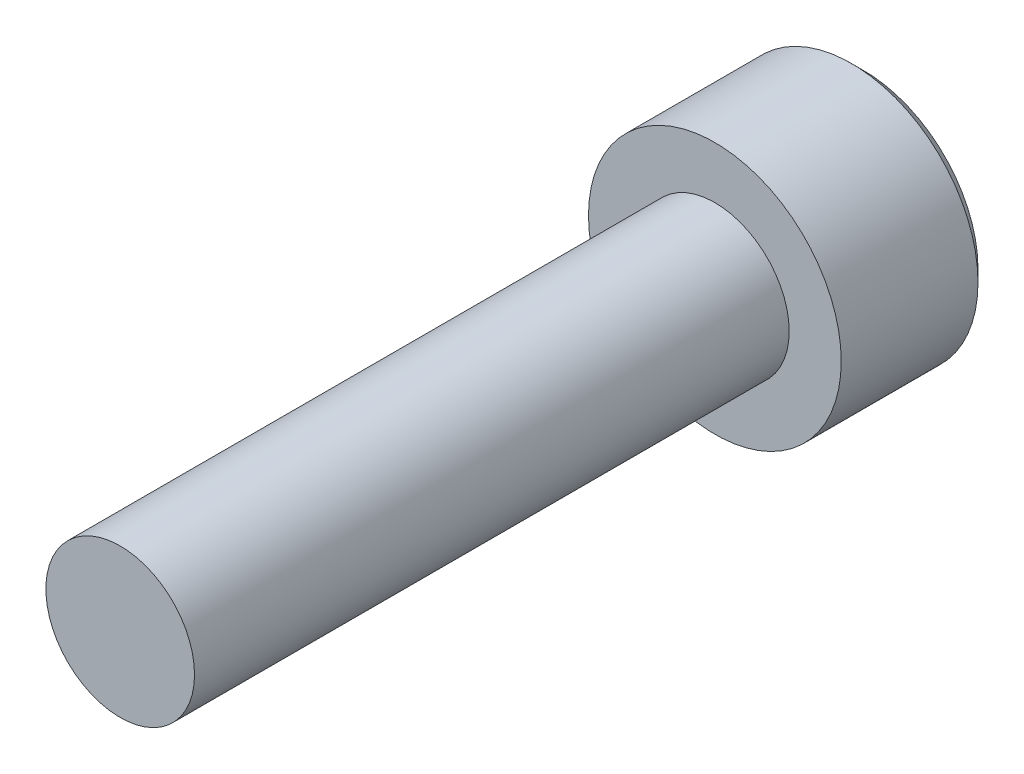
ISO-10303-21;
HEADER;
FILE_DESCRIPTION(('STEP AP214'),'2;1');
FILE_NAME('part.step','',(''),(''),'','','');
FILE_SCHEMA(('AUTOMOTIVE_DESIGN { 1 0 10303 214 1 1 1 1 }'));
ENDSEC;
DATA;
#1=APPLICATION_CONTEXT('core data for automotive mechanical design processes');
#2=APPLICATION_PROTOCOL_DEFINITION('international standard','automotive_design',2000,#1);
#3=PRODUCT_CONTEXT('',#1,'mechanical');
#4=PRODUCT('Part','Part','',(#3));
#5=PRODUCT_RELATED_PRODUCT_CATEGORY('part','',(#4));
#6=PRODUCT_DEFINITION_FORMATION('','',#4);
#7=PRODUCT_DEFINITION_CONTEXT('part definition',#1,'design');
#8=PRODUCT_DEFINITION('design','',#6,#7);
#9=PRODUCT_DEFINITION_SHAPE('','',#8);
#10=(LENGTH_UNIT() NAMED_UNIT(*) SI_UNIT(.MILLI.,.METRE.));
#11=(NAMED_UNIT(*) PLANE_ANGLE_UNIT() SI_UNIT($,.RADIAN.));
#12=(NAMED_UNIT(*) SI_UNIT($,.STERADIAN.) SOLID_ANGLE_UNIT());
#13=UNCERTAINTY_MEASURE_WITH_UNIT(LENGTH_MEASURE(1.E-05),#10,'distance_accuracy_value','');
#14=(GEOMETRIC_REPRESENTATION_CONTEXT(3) GLOBAL_UNCERTAINTY_ASSIGNED_CONTEXT((#13)) GLOBAL_UNIT_ASSIGNED_CONTEXT((#10,
#11,#12)) REPRESENTATION_CONTEXT('',''));
#15=CARTESIAN_POINT('',(0.,0.,0.));
#16=DIRECTION('',(0.,0.,1.));
#17=DIRECTION('',(1.,0.,0.));
#18=AXIS2_PLACEMENT_3D('',#15,#16,#17);
#19=CARTESIAN_POINT('',(0.,0.,0.));
#20=DIRECTION('',(0.,0.,1.));
#21=DIRECTION('',(1.,0.,0.));
#22=AXIS2_PLACEMENT_3D('',#19,#20,#21);
#23=PLANE('',#22);
#24=DIRECTION('',(0.5,-0.866025403784439,0.));
#25=VECTOR('',#24,1.);
#26=CARTESIAN_POINT('',(-1.50111069989302,-2.2,0.));
#27=LINE('',#26,#25);
#28=CARTESIAN_POINT('',(-2.7712812921102,0.,0.));
#29=VERTEX_POINT('',#28);
#30=CARTESIAN_POINT('',(-1.3856406460551,-2.4,0.));
#31=VERTEX_POINT('',#30);
#32=EDGE_CURVE('E163',#29,#31,#27,.T.);
#33=ORIENTED_EDGE('',*,*,#32,.T.);
#34=DIRECTION('',(1.,0.,0.));
#35=VECTOR('',#34,1.);
#36=CARTESIAN_POINT('',(1.15470053837925,-2.4,0.));
#37=LINE('',#36,#35);
#38=CARTESIAN_POINT('',(1.3856406460551,-2.4,0.));
#39=VERTEX_POINT('',#38);
#40=EDGE_CURVE('E165',#31,#39,#37,.T.);
#41=ORIENTED_EDGE('',*,*,#40,.T.);
#42=DIRECTION('',(0.5,0.866025403784439,0.));
#43=VECTOR('',#42,1.);
#44=CARTESIAN_POINT('',(2.65581123827227,-0.199999999999998,0.));
#45=LINE('',#44,#43);
#46=CARTESIAN_POINT('',(2.7712812921102,0.,0.));
#47=VERTEX_POINT('',#46);
#48=EDGE_CURVE('E155',#39,#47,#45,.T.);
#49=ORIENTED_EDGE('',*,*,#48,.T.);
#50=DIRECTION('',(-0.5,0.866025403784439,0.));
#51=VECTOR('',#50,1.);
#52=CARTESIAN_POINT('',(1.50111069989302,2.2,0.));
#53=LINE('',#52,#51);
#54=CARTESIAN_POINT('',(1.3856406460551,2.4,0.));
#55=VERTEX_POINT('',#54);
#56=EDGE_CURVE('E157',#47,#55,#53,.T.);
#57=ORIENTED_EDGE('',*,*,#56,.T.);
#58=DIRECTION('',(-1.,0.,0.));
#59=VECTOR('',#58,1.);
#60=CARTESIAN_POINT('',(-1.15470053837925,2.4,0.));
#61=LINE('',#60,#59);
#62=CARTESIAN_POINT('',(-1.3856406460551,2.4,0.));
#63=VERTEX_POINT('',#62);
#64=EDGE_CURVE('E159',#55,#63,#61,.T.);
#65=ORIENTED_EDGE('',*,*,#64,.T.);
#66=DIRECTION('',(-0.5,-0.866025403784439,0.));
#67=VECTOR('',#66,1.);
#68=CARTESIAN_POINT('',(-2.65581123827227,0.199999999999998,0.));
#69=LINE('',#68,#67);
#70=EDGE_CURVE('E161',#63,#29,#69,.T.);
#71=ORIENTED_EDGE('',*,*,#70,.T.);
#72=EDGE_LOOP('',(#33,#41,#49,#57,#65,#71));
#73=FACE_BOUND('',#72,.T.);
#74=CARTESIAN_POINT('',(0.,0.,0.));
#75=DIRECTION('',(0.,0.,1.));
#76=DIRECTION('',(1.,0.,0.));
#77=AXIS2_PLACEMENT_3D('',#74,#75,#76);
#78=CIRCLE('',#77,3.85);
#79=CARTESIAN_POINT('',(3.85,0.,0.));
#80=VERTEX_POINT('',#79);
#81=EDGE_CURVE('E150',#80,#80,#78,.F.);
#82=ORIENTED_EDGE('',*,*,#81,.T.);
#83=EDGE_LOOP('',(#82));
#84=FACE_BOUND('',#83,.T.);
#85=ADVANCED_FACE('F43',(#73,#84),#23,.F.);
#86=CARTESIAN_POINT('',(0.,0.,25.));
#87=DIRECTION('',(0.,0.,-1.));
#88=DIRECTION('',(-1.,0.,0.));
#89=AXIS2_PLACEMENT_3D('',#86,#87,#88);
#90=CYLINDRICAL_SURFACE('',#89,2.5);
#91=CARTESIAN_POINT('',(0.,0.,5.));
#92=DIRECTION('',(0.,0.,1.));
#93=DIRECTION('',(1.,0.,0.));
#94=AXIS2_PLACEMENT_3D('',#91,#92,#93);
#95=CIRCLE('',#94,2.5);
#96=CARTESIAN_POINT('',(2.5,0.,5.));
#97=VERTEX_POINT('',#96);
#98=EDGE_CURVE('E141',#97,#97,#95,.T.);
#99=ORIENTED_EDGE('',*,*,#98,.T.);
#100=EDGE_LOOP('',(#99));
#101=FACE_BOUND('',#100,.T.);
#102=CARTESIAN_POINT('',(0.,0.,25.));
#103=DIRECTION('',(0.,0.,1.));
#104=DIRECTION('',(1.,0.,0.));
#105=AXIS2_PLACEMENT_3D('',#102,#103,#104);
#106=CIRCLE('',#105,2.5);
#107=CARTESIAN_POINT('',(2.5,0.,25.));
#108=VERTEX_POINT('',#107);
#109=EDGE_CURVE('E147',#108,#108,#106,.T.);
#110=ORIENTED_EDGE('',*,*,#109,.F.);
#111=EDGE_LOOP('',(#110));
#112=FACE_BOUND('',#111,.T.);
#113=ADVANCED_FACE('F251',(#101,#112),#90,.T.);
#114=CARTESIAN_POINT('',(0.,0.,25.));
#115=DIRECTION('',(0.,0.,1.));
#116=DIRECTION('',(1.,0.,0.));
#117=AXIS2_PLACEMENT_3D('',#114,#115,#116);
#118=PLANE('',#117);
#119=ORIENTED_EDGE('',*,*,#109,.T.);
#120=EDGE_LOOP('',(#119));
#121=FACE_BOUND('',#120,.T.);
#122=ADVANCED_FACE('F259',(#121),#118,.T.);
#123=CARTESIAN_POINT('',(0.,0.,5.));
#124=DIRECTION('',(0.,0.,-1.));
#125=DIRECTION('',(-1.,0.,0.));
#126=AXIS2_PLACEMENT_3D('',#123,#124,#125);
#127=CYLINDRICAL_SURFACE('',#126,4.25);
#128=CARTESIAN_POINT('',(0.,0.,0.399999999999996));
#129=DIRECTION('',(0.,0.,1.));
#130=DIRECTION('',(1.,0.,0.));
#131=AXIS2_PLACEMENT_3D('',#128,#129,#130);
#132=CIRCLE('',#131,4.25);
#133=CARTESIAN_POINT('',(4.25,0.,0.399999999999996));
#134=VERTEX_POINT('',#133);
#135=EDGE_CURVE('E11',#134,#134,#132,.T.);
#136=ORIENTED_EDGE('',*,*,#135,.T.);
#137=EDGE_LOOP('',(#136));
#138=FACE_BOUND('',#137,.T.);
#139=CARTESIAN_POINT('',(0.,0.,5.));
#140=DIRECTION('',(0.,0.,1.));
#141=DIRECTION('',(1.,0.,0.));
#142=AXIS2_PLACEMENT_3D('',#139,#140,#141);
#143=CIRCLE('',#142,4.25);
#144=CARTESIAN_POINT('',(4.25,0.,5.));
#145=VERTEX_POINT('',#144);
#146=EDGE_CURVE('E137',#145,#145,#143,.T.);
#147=ORIENTED_EDGE('',*,*,#146,.F.);
#148=EDGE_LOOP('',(#147));
#149=FACE_BOUND('',#148,.T.);
#150=ADVANCED_FACE('F367',(#138,#149),#127,.T.);
#151=CARTESIAN_POINT('',(0.,0.,5.));
#152=DIRECTION('',(0.,0.,1.));
#153=DIRECTION('',(1.,0.,0.));
#154=AXIS2_PLACEMENT_3D('',#151,#152,#153);
#155=PLANE('',#154);
#156=ORIENTED_EDGE('',*,*,#98,.F.);
#157=EDGE_LOOP('',(#156));
#158=FACE_BOUND('',#157,.T.);
#159=ORIENTED_EDGE('',*,*,#146,.T.);
#160=EDGE_LOOP('',(#159));
#161=FACE_BOUND('',#160,.T.);
#162=ADVANCED_FACE('F369',(#158,#161),#155,.T.);
#163=CARTESIAN_POINT('',(1.15470053837925,-2.,3.));
#164=DIRECTION('',(-0.866025403784439,0.5,0.));
#165=DIRECTION('',(-0.5,-0.866025403784439,0.));
#166=AXIS2_PLACEMENT_3D('',#163,#164,#165);
#167=PLANE('',#166);
#168=DIRECTION('',(0.,0.,-1.));
#169=VECTOR('',#168,1.);
#170=CARTESIAN_POINT('',(2.3094010767585,0.,3.));
#171=LINE('',#170,#169);
#172=CARTESIAN_POINT('',(2.3094010767585,0.,3.));
#173=VERTEX_POINT('',#172);
#174=CARTESIAN_POINT('',(2.3094010767585,0.,0.399999999999998));
#175=VERTEX_POINT('',#174);
#176=EDGE_CURVE('E131',#173,#175,#171,.T.);
#177=ORIENTED_EDGE('',*,*,#176,.T.);
#178=DIRECTION('',(-0.5,-0.866025403784439,0.));
#179=VECTOR('',#178,1.);
#180=CARTESIAN_POINT('',(1.15470053837925,-2.,0.399999999999998));
#181=LINE('',#180,#179);
#182=CARTESIAN_POINT('',(1.15470053837925,-2.,0.399999999999998));
#183=VERTEX_POINT('',#182);
#184=EDGE_CURVE('E53',#175,#183,#181,.T.);
#185=ORIENTED_EDGE('',*,*,#184,.T.);
#186=DIRECTION('',(0.,0.,-1.));
#187=VECTOR('',#186,1.);
#188=CARTESIAN_POINT('',(1.15470053837925,-2.,3.));
#189=LINE('',#188,#187);
#190=CARTESIAN_POINT('',(1.15470053837925,-2.,3.));
#191=VERTEX_POINT('',#190);
#192=EDGE_CURVE('E134',#191,#183,#189,.T.);
#193=ORIENTED_EDGE('',*,*,#192,.F.);
#194=DIRECTION('',(0.5,0.866025403784439,0.));
#195=VECTOR('',#194,1.);
#196=CARTESIAN_POINT('',(1.15470053837925,-2.,3.));
#197=LINE('',#196,#195);
#198=EDGE_CURVE('E124',#191,#173,#197,.T.);
#199=ORIENTED_EDGE('',*,*,#198,.T.);
#200=EDGE_LOOP('',(#177,#185,#193,#199));
#201=FACE_BOUND('',#200,.T.);
#202=ADVANCED_FACE('F130',(#201),#167,.T.);
#203=CARTESIAN_POINT('',(2.3094010767585,0.,3.));
#204=DIRECTION('',(-0.866025403784439,-0.5,0.));
#205=DIRECTION('',(0.5,-0.866025403784439,0.));
#206=AXIS2_PLACEMENT_3D('',#203,#204,#205);
#207=PLANE('',#206);
#208=DIRECTION('',(0.,0.,-1.));
#209=VECTOR('',#208,1.);
#210=CARTESIAN_POINT('',(1.15470053837925,2.,3.));
#211=LINE('',#210,#209);
#212=CARTESIAN_POINT('',(1.15470053837925,2.,3.));
#213=VERTEX_POINT('',#212);
#214=CARTESIAN_POINT('',(1.15470053837925,2.,0.399999999999998));
#215=VERTEX_POINT('',#214);
#216=EDGE_CURVE('E138',#213,#215,#211,.T.);
#217=ORIENTED_EDGE('',*,*,#216,.T.);
#218=DIRECTION('',(0.5,-0.866025403784439,0.));
#219=VECTOR('',#218,1.);
#220=CARTESIAN_POINT('',(2.3094010767585,0.,0.399999999999998));
#221=LINE('',#220,#219);
#222=EDGE_CURVE('E61',#215,#175,#221,.T.);
#223=ORIENTED_EDGE('',*,*,#222,.T.);
#224=ORIENTED_EDGE('',*,*,#176,.F.);
#225=DIRECTION('',(-0.5,0.866025403784439,0.));
#226=VECTOR('',#225,1.);
#227=CARTESIAN_POINT('',(2.3094010767585,0.,3.));
#228=LINE('',#227,#226);
#229=EDGE_CURVE('E120',#173,#213,#228,.T.);
#230=ORIENTED_EDGE('',*,*,#229,.T.);
#231=EDGE_LOOP('',(#217,#223,#224,#230));
#232=FACE_BOUND('',#231,.T.);
#233=ADVANCED_FACE('F136',(#232),#207,.T.);
#234=CARTESIAN_POINT('',(1.15470053837925,2.,3.));
#235=DIRECTION('',(0.,-1.,0.));
#236=DIRECTION('',(0.,0.,-1.));
#237=AXIS2_PLACEMENT_3D('',#234,#235,#236);
#238=PLANE('',#237);
#239=DIRECTION('',(0.,0.,-1.));
#240=VECTOR('',#239,1.);
#241=CARTESIAN_POINT('',(-1.15470053837925,2.,3.));
#242=LINE('',#241,#240);
#243=CARTESIAN_POINT('',(-1.15470053837925,2.,3.));
#244=VERTEX_POINT('',#243);
#245=CARTESIAN_POINT('',(-1.15470053837925,2.,0.399999999999998));
#246=VERTEX_POINT('',#245);
#247=EDGE_CURVE('E143',#244,#246,#242,.T.);
#248=ORIENTED_EDGE('',*,*,#247,.T.);
#249=DIRECTION('',(1.,0.,0.));
#250=VECTOR('',#249,1.);
#251=CARTESIAN_POINT('',(1.15470053837925,2.,0.399999999999998));
#252=LINE('',#251,#250);
#253=EDGE_CURVE('E69',#246,#215,#252,.T.);
#254=ORIENTED_EDGE('',*,*,#253,.T.);
#255=ORIENTED_EDGE('',*,*,#216,.F.);
#256=DIRECTION('',(-1.,0.,0.));
#257=VECTOR('',#256,1.);
#258=CARTESIAN_POINT('',(1.15470053837925,2.,3.));
#259=LINE('',#258,#257);
#260=EDGE_CURVE('E126',#213,#244,#259,.T.);
#261=ORIENTED_EDGE('',*,*,#260,.T.);
#262=EDGE_LOOP('',(#248,#254,#255,#261));
#263=FACE_BOUND('',#262,.T.);
#264=ADVANCED_FACE('F241',(#263),#238,.T.);
#265=CARTESIAN_POINT('',(-1.15470053837925,2.,3.));
#266=DIRECTION('',(0.866025403784439,-0.5,0.));
#267=DIRECTION('',(0.5,0.866025403784439,0.));
#268=AXIS2_PLACEMENT_3D('',#265,#266,#267);
#269=PLANE('',#268);
#270=DIRECTION('',(0.,0.,-1.));
#271=VECTOR('',#270,1.);
#272=CARTESIAN_POINT('',(-2.3094010767585,0.,3.));
#273=LINE('',#272,#271);
#274=CARTESIAN_POINT('',(-2.3094010767585,0.,3.));
#275=VERTEX_POINT('',#274);
#276=CARTESIAN_POINT('',(-2.3094010767585,0.,0.399999999999998));
#277=VERTEX_POINT('',#276);
#278=EDGE_CURVE('E228',#275,#277,#273,.T.);
#279=ORIENTED_EDGE('',*,*,#278,.T.);
#280=DIRECTION('',(0.5,0.866025403784439,0.));
#281=VECTOR('',#280,1.);
#282=CARTESIAN_POINT('',(-1.15470053837925,2.,0.399999999999998));
#283=LINE('',#282,#281);
#284=EDGE_CURVE('E173',#277,#246,#283,.T.);
#285=ORIENTED_EDGE('',*,*,#284,.T.);
#286=ORIENTED_EDGE('',*,*,#247,.F.);
#287=DIRECTION('',(-0.5,-0.866025403784439,0.));
#288=VECTOR('',#287,1.);
#289=CARTESIAN_POINT('',(-1.15470053837925,2.,3.));
#290=LINE('',#289,#288);
#291=EDGE_CURVE('E233',#244,#275,#290,.T.);
#292=ORIENTED_EDGE('',*,*,#291,.T.);
#293=EDGE_LOOP('',(#279,#285,#286,#292));
#294=FACE_BOUND('',#293,.T.);
#295=ADVANCED_FACE('F231',(#294),#269,.T.);
#296=CARTESIAN_POINT('',(-2.3094010767585,0.,3.));
#297=DIRECTION('',(0.866025403784439,0.5,0.));
#298=DIRECTION('',(-0.5,0.866025403784439,0.));
#299=AXIS2_PLACEMENT_3D('',#296,#297,#298);
#300=PLANE('',#299);
#301=DIRECTION('',(0.,0.,-1.));
#302=VECTOR('',#301,1.);
#303=CARTESIAN_POINT('',(-1.15470053837925,-2.,3.));
#304=LINE('',#303,#302);
#305=CARTESIAN_POINT('',(-1.15470053837925,-2.,3.));
#306=VERTEX_POINT('',#305);
#307=CARTESIAN_POINT('',(-1.15470053837925,-2.,0.399999999999998));
#308=VERTEX_POINT('',#307);
#309=EDGE_CURVE('E214',#306,#308,#304,.T.);
#310=ORIENTED_EDGE('',*,*,#309,.T.);
#311=DIRECTION('',(-0.5,0.866025403784439,0.));
#312=VECTOR('',#311,1.);
#313=CARTESIAN_POINT('',(-2.3094010767585,0.,0.399999999999998));
#314=LINE('',#313,#312);
#315=EDGE_CURVE('E171',#308,#277,#314,.T.);
#316=ORIENTED_EDGE('',*,*,#315,.T.);
#317=ORIENTED_EDGE('',*,*,#278,.F.);
#318=DIRECTION('',(0.5,-0.866025403784439,0.));
#319=VECTOR('',#318,1.);
#320=CARTESIAN_POINT('',(-2.3094010767585,0.,3.));
#321=LINE('',#320,#319);
#322=EDGE_CURVE('E238',#275,#306,#321,.T.);
#323=ORIENTED_EDGE('',*,*,#322,.T.);
#324=EDGE_LOOP('',(#310,#316,#317,#323));
#325=FACE_BOUND('',#324,.T.);
#326=ADVANCED_FACE('F227',(#325),#300,.T.);
#327=CARTESIAN_POINT('',(-1.15470053837925,-2.,3.));
#328=DIRECTION('',(0.,1.,0.));
#329=DIRECTION('',(0.,0.,1.));
#330=AXIS2_PLACEMENT_3D('',#327,#328,#329);
#331=PLANE('',#330);
#332=ORIENTED_EDGE('',*,*,#192,.T.);
#333=DIRECTION('',(-1.,0.,0.));
#334=VECTOR('',#333,1.);
#335=CARTESIAN_POINT('',(-1.15470053837925,-2.,0.399999999999998));
#336=LINE('',#335,#334);
#337=EDGE_CURVE('E168',#183,#308,#336,.T.);
#338=ORIENTED_EDGE('',*,*,#337,.T.);
#339=ORIENTED_EDGE('',*,*,#309,.F.);
#340=DIRECTION('',(1.,0.,0.));
#341=VECTOR('',#340,1.);
#342=CARTESIAN_POINT('',(-1.15470053837925,-2.,3.));
#343=LINE('',#342,#341);
#344=EDGE_CURVE('E213',#306,#191,#343,.T.);
#345=ORIENTED_EDGE('',*,*,#344,.T.);
#346=EDGE_LOOP('',(#332,#338,#339,#345));
#347=FACE_BOUND('',#346,.T.);
#348=ADVANCED_FACE('F210',(#347),#331,.T.);
#349=CARTESIAN_POINT('',(0.,0.,3.));
#350=DIRECTION('',(0.,0.,1.));
#351=DIRECTION('',(1.,0.,0.));
#352=AXIS2_PLACEMENT_3D('',#349,#350,#351);
#353=PLANE('',#352);
#354=ORIENTED_EDGE('',*,*,#198,.F.);
#355=ORIENTED_EDGE('',*,*,#344,.F.);
#356=ORIENTED_EDGE('',*,*,#322,.F.);
#357=ORIENTED_EDGE('',*,*,#291,.F.);
#358=ORIENTED_EDGE('',*,*,#260,.F.);
#359=ORIENTED_EDGE('',*,*,#229,.F.);
#360=EDGE_LOOP('',(#354,#355,#356,#357,#358,#359));
#361=FACE_BOUND('',#360,.T.);
#362=ADVANCED_FACE('F122',(#361),#353,.F.);
#363=CARTESIAN_POINT('',(0.,2.4,0.));
#364=DIRECTION('',(0.,-0.707106781186548,-0.707106781186547));
#365=DIRECTION('',(1.,0.,0.));
#366=AXIS2_PLACEMENT_3D('',#363,#364,#365);
#367=PLANE('',#366);
#368=DIRECTION('',(0.377964473009225,0.654653670707977,-0.654653670707978));
#369=VECTOR('',#368,1.);
#370=CARTESIAN_POINT('',(1.18769198233294,2.05714285714286,0.342857142857141));
#371=LINE('',#370,#369);
#372=EDGE_CURVE('E187',#215,#55,#371,.T.);
#373=ORIENTED_EDGE('',*,*,#372,.F.);
#374=ORIENTED_EDGE('',*,*,#253,.F.);
#375=DIRECTION('',(-0.377964473009226,0.654653670707977,-0.654653670707978));
#376=VECTOR('',#375,1.);
#377=CARTESIAN_POINT('',(-1.18769198233294,2.05714285714285,0.342857142857144));
#378=LINE('',#377,#376);
#379=EDGE_CURVE('E48',#63,#246,#378,.F.);
#380=ORIENTED_EDGE('',*,*,#379,.F.);
#381=ORIENTED_EDGE('',*,*,#64,.F.);
#382=EDGE_LOOP('',(#373,#374,#380,#381));
#383=FACE_BOUND('',#382,.T.);
#384=ADVANCED_FACE('F201',(#383),#367,.T.);
#385=CARTESIAN_POINT('',(-2.07846096908265,1.2,0.));
#386=DIRECTION('',(0.612372435695796,-0.353553390593274,-0.707106781186546));
#387=DIRECTION('',(0.5,0.866025403784439,0.));
#388=AXIS2_PLACEMENT_3D('',#385,#386,#387);
#389=PLANE('',#388);
#390=ORIENTED_EDGE('',*,*,#379,.T.);
#391=ORIENTED_EDGE('',*,*,#284,.F.);
#392=DIRECTION('',(-0.755928946018453,0.,-0.654653670707979));
#393=VECTOR('',#392,1.);
#394=CARTESIAN_POINT('',(-2.37538396466589,0.,0.342857142857143));
#395=LINE('',#394,#393);
#396=EDGE_CURVE('E185',#29,#277,#395,.F.);
#397=ORIENTED_EDGE('',*,*,#396,.F.);
#398=ORIENTED_EDGE('',*,*,#70,.F.);
#399=EDGE_LOOP('',(#390,#391,#397,#398));
#400=FACE_BOUND('',#399,.T.);
#401=ADVANCED_FACE('F197',(#400),#389,.T.);
#402=CARTESIAN_POINT('',(2.07846096908265,1.2,0.));
#403=DIRECTION('',(-0.612372435695796,-0.353553390593274,-0.707106781186546));
#404=DIRECTION('',(0.5,-0.866025403784439,0.));
#405=AXIS2_PLACEMENT_3D('',#402,#403,#404);
#406=PLANE('',#405);
#407=ORIENTED_EDGE('',*,*,#372,.T.);
#408=ORIENTED_EDGE('',*,*,#56,.F.);
#409=DIRECTION('',(0.755928946018453,0.,-0.654653670707979));
#410=VECTOR('',#409,1.);
#411=CARTESIAN_POINT('',(2.37538396466589,0.,0.342857142857143));
#412=LINE('',#411,#410);
#413=EDGE_CURVE('E182',#175,#47,#412,.T.);
#414=ORIENTED_EDGE('',*,*,#413,.F.);
#415=ORIENTED_EDGE('',*,*,#222,.F.);
#416=EDGE_LOOP('',(#407,#408,#414,#415));
#417=FACE_BOUND('',#416,.T.);
#418=ADVANCED_FACE('F202',(#417),#406,.T.);
#419=CARTESIAN_POINT('',(-2.07846096908265,-1.2,0.));
#420=DIRECTION('',(0.612372435695796,0.353553390593274,-0.707106781186546));
#421=DIRECTION('',(-0.5,0.866025403784439,0.));
#422=AXIS2_PLACEMENT_3D('',#419,#420,#421);
#423=PLANE('',#422);
#424=ORIENTED_EDGE('',*,*,#396,.T.);
#425=ORIENTED_EDGE('',*,*,#315,.F.);
#426=DIRECTION('',(-0.377964473009225,-0.654653670707977,-0.654653670707978));
#427=VECTOR('',#426,1.);
#428=CARTESIAN_POINT('',(-1.18769198233294,-2.05714285714286,0.342857142857141));
#429=LINE('',#428,#427);
#430=EDGE_CURVE('E180',#31,#308,#429,.F.);
#431=ORIENTED_EDGE('',*,*,#430,.F.);
#432=ORIENTED_EDGE('',*,*,#32,.F.);
#433=EDGE_LOOP('',(#424,#425,#431,#432));
#434=FACE_BOUND('',#433,.T.);
#435=ADVANCED_FACE('F223',(#434),#423,.T.);
#436=CARTESIAN_POINT('',(2.07846096908265,-1.2,0.));
#437=DIRECTION('',(-0.612372435695796,0.353553390593274,-0.707106781186546));
#438=DIRECTION('',(-0.5,-0.866025403784439,0.));
#439=AXIS2_PLACEMENT_3D('',#436,#437,#438);
#440=PLANE('',#439);
#441=ORIENTED_EDGE('',*,*,#413,.T.);
#442=ORIENTED_EDGE('',*,*,#48,.F.);
#443=DIRECTION('',(-0.377964473009226,0.654653670707977,0.654653670707978));
#444=VECTOR('',#443,1.);
#445=CARTESIAN_POINT('',(1.18769198233294,-2.05714285714286,0.342857142857141));
#446=LINE('',#445,#444);
#447=EDGE_CURVE('E178',#183,#39,#446,.F.);
#448=ORIENTED_EDGE('',*,*,#447,.F.);
#449=ORIENTED_EDGE('',*,*,#184,.F.);
#450=EDGE_LOOP('',(#441,#442,#448,#449));
#451=FACE_BOUND('',#450,.T.);
#452=ADVANCED_FACE('F207',(#451),#440,.T.);
#453=CARTESIAN_POINT('',(0.,-2.4,0.));
#454=DIRECTION('',(0.,0.707106781186548,-0.707106781186547));
#455=DIRECTION('',(-1.,0.,0.));
#456=AXIS2_PLACEMENT_3D('',#453,#454,#455);
#457=PLANE('',#456);
#458=ORIENTED_EDGE('',*,*,#430,.T.);
#459=ORIENTED_EDGE('',*,*,#337,.F.);
#460=ORIENTED_EDGE('',*,*,#447,.T.);
#461=ORIENTED_EDGE('',*,*,#40,.F.);
#462=EDGE_LOOP('',(#458,#459,#460,#461));
#463=FACE_BOUND('',#462,.T.);
#464=ADVANCED_FACE('F217',(#463),#457,.T.);
#465=CARTESIAN_POINT('',(0.,0.,0.399999999999996));
#466=DIRECTION('',(0.,0.,1.));
#467=DIRECTION('',(1.,0.,0.));
#468=AXIS2_PLACEMENT_3D('',#465,#466,#467);
#469=CONICAL_SURFACE('',#468,4.25,0.785398163397455);
#470=ORIENTED_EDGE('',*,*,#81,.F.);
#471=EDGE_LOOP('',(#470));
#472=FACE_BOUND('',#471,.T.);
#473=ORIENTED_EDGE('',*,*,#135,.F.);
#474=EDGE_LOOP('',(#473));
#475=FACE_BOUND('',#474,.T.);
#476=ADVANCED_FACE('F46',(#472,#475),#469,.T.);
#477=CLOSED_SHELL('',(#85,#113,#122,#150,#162,#202,#233,#264,#295,#326,#348,#362,#384,#401,#418,
#435,#452,#464,#476));
#478=MANIFOLD_SOLID_BREP('B2',#477);
#479=ADVANCED_BREP_SHAPE_REPRESENTATION('',(#18,#478),#14);
#480=SHAPE_DEFINITION_REPRESENTATION(#9,#479);
ENDSEC;
END-ISO-10303-21;
